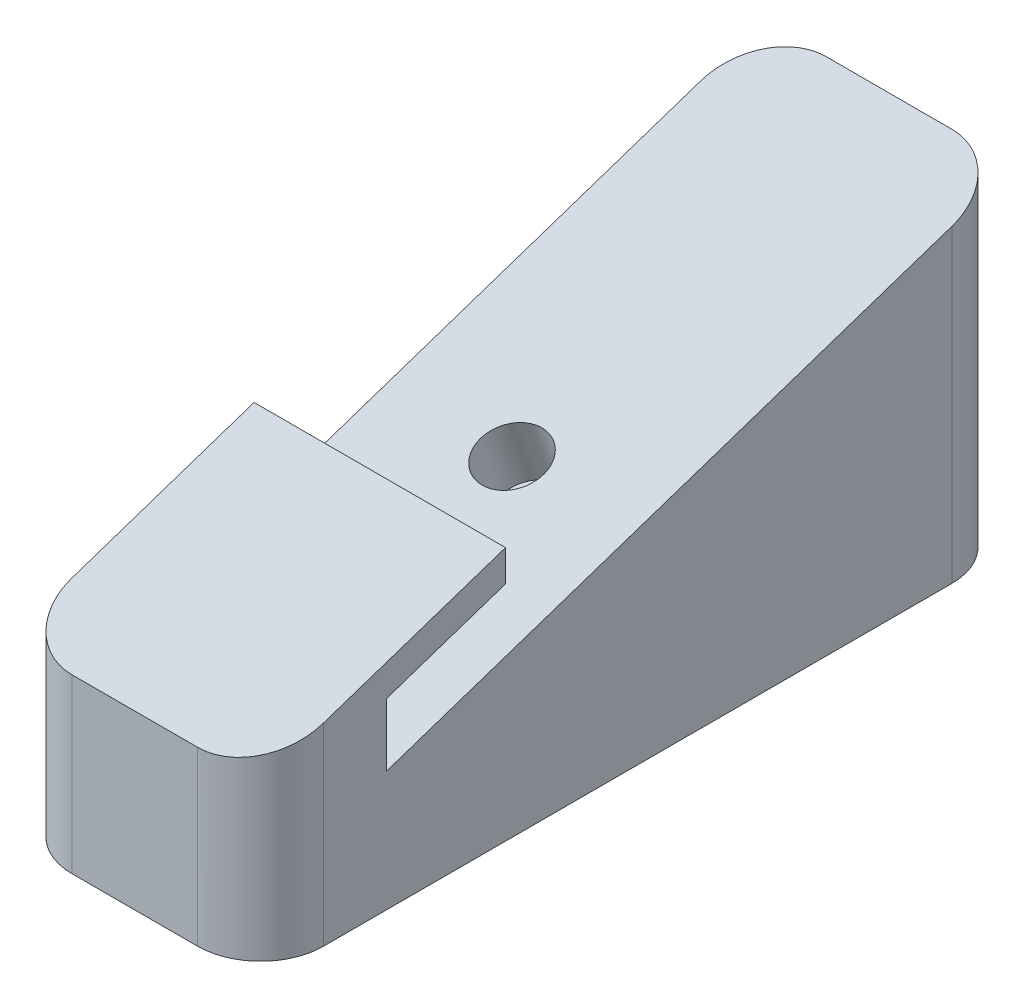
ISO-10303-21;
HEADER;
FILE_DESCRIPTION(('STEP AP214'),'2;1');
FILE_NAME('part.step','',(''),(''),'','','');
FILE_SCHEMA(('AUTOMOTIVE_DESIGN { 1 0 10303 214 1 1 1 1 }'));
ENDSEC;
DATA;
#1=APPLICATION_CONTEXT('core data for automotive mechanical design processes');
#2=APPLICATION_PROTOCOL_DEFINITION('international standard','automotive_design',2000,#1);
#3=PRODUCT_CONTEXT('',#1,'mechanical');
#4=PRODUCT('Part','Part','',(#3));
#5=PRODUCT_RELATED_PRODUCT_CATEGORY('part','',(#4));
#6=PRODUCT_DEFINITION_FORMATION('','',#4);
#7=PRODUCT_DEFINITION_CONTEXT('part definition',#1,'design');
#8=PRODUCT_DEFINITION('design','',#6,#7);
#9=PRODUCT_DEFINITION_SHAPE('','',#8);
#10=(LENGTH_UNIT() NAMED_UNIT(*) SI_UNIT(.MILLI.,.METRE.));
#11=(NAMED_UNIT(*) PLANE_ANGLE_UNIT() SI_UNIT($,.RADIAN.));
#12=(NAMED_UNIT(*) SI_UNIT($,.STERADIAN.) SOLID_ANGLE_UNIT());
#13=UNCERTAINTY_MEASURE_WITH_UNIT(LENGTH_MEASURE(1.E-05),#10,'distance_accuracy_value','');
#14=(GEOMETRIC_REPRESENTATION_CONTEXT(3) GLOBAL_UNCERTAINTY_ASSIGNED_CONTEXT((#13)) GLOBAL_UNIT_ASSIGNED_CONTEXT((#10,
#11,#12)) REPRESENTATION_CONTEXT('',''));
#15=CARTESIAN_POINT('',(0.,0.,0.));
#16=DIRECTION('',(0.,0.,1.));
#17=DIRECTION('',(1.,0.,0.));
#18=AXIS2_PLACEMENT_3D('',#15,#16,#17);
#19=CARTESIAN_POINT('',(-12.7,21.6537972116183,25.4));
#20=DIRECTION('',(0.,0.,-1.));
#21=DIRECTION('',(-1.,0.,0.));
#22=AXIS2_PLACEMENT_3D('',#19,#20,#21);
#23=PLANE('',#22);
#24=DIRECTION('',(0.,-1.,0.));
#25=VECTOR('',#24,1.);
#26=CARTESIAN_POINT('',(-12.7,21.6537972116183,25.4));
#27=LINE('',#26,#25);
#28=CARTESIAN_POINT('',(-12.7,18.4787972116183,25.4));
#29=VERTEX_POINT('',#28);
#30=CARTESIAN_POINT('',(-12.7,12.1287972116183,25.4));
#31=VERTEX_POINT('',#30);
#32=EDGE_CURVE('E164',#29,#31,#27,.T.);
#33=ORIENTED_EDGE('',*,*,#32,.F.);
#34=DIRECTION('',(-1.,0.,0.));
#35=VECTOR('',#34,1.);
#36=CARTESIAN_POINT('',(12.7,18.4787972116183,25.4));
#37=LINE('',#36,#35);
#38=CARTESIAN_POINT('',(12.7,18.4787972116183,25.4));
#39=VERTEX_POINT('',#38);
#40=EDGE_CURVE('E145',#39,#29,#37,.T.);
#41=ORIENTED_EDGE('',*,*,#40,.F.);
#42=DIRECTION('',(0.,-1.,0.));
#43=VECTOR('',#42,1.);
#44=CARTESIAN_POINT('',(12.7,21.6537972116183,25.4));
#45=LINE('',#44,#43);
#46=CARTESIAN_POINT('',(12.7,12.1287972116183,25.4));
#47=VERTEX_POINT('',#46);
#48=EDGE_CURVE('E151',#39,#47,#45,.T.);
#49=ORIENTED_EDGE('',*,*,#48,.T.);
#50=DIRECTION('',(1.,0.,0.));
#51=VECTOR('',#50,1.);
#52=CARTESIAN_POINT('',(-12.7,12.1287972116183,25.4));
#53=LINE('',#52,#51);
#54=EDGE_CURVE('E152',#31,#47,#53,.T.);
#55=ORIENTED_EDGE('',*,*,#54,.F.);
#56=EDGE_LOOP('',(#33,#41,#49,#55));
#57=FACE_BOUND('',#56,.T.);
#58=ADVANCED_FACE('F35',(#57),#23,.T.);
#59=CARTESIAN_POINT('',(0.,33.3756,38.1));
#60=DIRECTION('',(0.,0.,-1.));
#61=DIRECTION('',(-1.,0.,0.));
#62=AXIS2_PLACEMENT_3D('',#59,#60,#61);
#63=PLANE('',#62);
#64=DIRECTION('',(1.,0.,0.));
#65=VECTOR('',#64,1.);
#66=CARTESIAN_POINT('',(-12.7,17.404436653942,38.1));
#67=LINE('',#66,#65);
#68=CARTESIAN_POINT('',(-6.35000000000002,17.404436653942,38.1));
#69=VERTEX_POINT('',#68);
#70=CARTESIAN_POINT('',(6.34999999999997,17.404436653942,38.1));
#71=VERTEX_POINT('',#70);
#72=EDGE_CURVE('E163',#69,#71,#67,.T.);
#73=ORIENTED_EDGE('',*,*,#72,.F.);
#74=DIRECTION('',(0.,-1.,0.));
#75=VECTOR('',#74,1.);
#76=CARTESIAN_POINT('',(-6.35000000000002,0.,38.1));
#77=LINE('',#76,#75);
#78=CARTESIAN_POINT('',(-6.35000000000002,0.,38.1));
#79=VERTEX_POINT('',#78);
#80=EDGE_CURVE('E192',#69,#79,#77,.T.);
#81=ORIENTED_EDGE('',*,*,#80,.T.);
#82=DIRECTION('',(1.,0.,0.));
#83=VECTOR('',#82,1.);
#84=CARTESIAN_POINT('',(0.,0.,38.1));
#85=LINE('',#84,#83);
#86=CARTESIAN_POINT('',(6.35000000000002,0.,38.1));
#87=VERTEX_POINT('',#86);
#88=EDGE_CURVE('E180',#79,#87,#85,.T.);
#89=ORIENTED_EDGE('',*,*,#88,.T.);
#90=DIRECTION('',(0.,-1.,0.));
#91=VECTOR('',#90,1.);
#92=CARTESIAN_POINT('',(6.35000000000002,33.3756,38.1));
#93=LINE('',#92,#91);
#94=EDGE_CURVE('E58',#87,#71,#93,.F.);
#95=ORIENTED_EDGE('',*,*,#94,.T.);
#96=EDGE_LOOP('',(#73,#81,#89,#95));
#97=FACE_BOUND('',#96,.T.);
#98=ADVANCED_FACE('F246',(#97),#63,.F.);
#99=CARTESIAN_POINT('',(12.7,33.3756,0.));
#100=DIRECTION('',(-1.,0.,0.));
#101=DIRECTION('',(0.,0.,1.));
#102=AXIS2_PLACEMENT_3D('',#99,#100,#101);
#103=PLANE('',#102);
#104=DIRECTION('',(0.,0.,-1.));
#105=VECTOR('',#104,1.);
#106=CARTESIAN_POINT('',(12.7,0.,0.));
#107=LINE('',#106,#105);
#108=CARTESIAN_POINT('',(12.7,0.,31.75));
#109=VERTEX_POINT('',#108);
#110=CARTESIAN_POINT('',(12.7,0.,-31.75));
#111=VERTEX_POINT('',#110);
#112=EDGE_CURVE('E200',#109,#111,#107,.T.);
#113=ORIENTED_EDGE('',*,*,#112,.T.);
#114=DIRECTION('',(0.,-1.,0.));
#115=VECTOR('',#114,1.);
#116=CARTESIAN_POINT('',(12.7,33.3756,-31.75));
#117=LINE('',#116,#115);
#118=CARTESIAN_POINT('',(12.7,31.2509197211618,-31.75));
#119=VERTEX_POINT('',#118);
#120=EDGE_CURVE('E11',#111,#119,#117,.F.);
#121=ORIENTED_EDGE('',*,*,#120,.T.);
#122=DIRECTION('',(0.,-0.317304656405093,0.948323655206199));
#123=VECTOR('',#122,1.);
#124=CARTESIAN_POINT('',(12.7,21.9110238089535,-3.83599353359909));
#125=LINE('',#124,#123);
#126=EDGE_CURVE('E177',#119,#47,#125,.T.);
#127=ORIENTED_EDGE('',*,*,#126,.T.);
#128=ORIENTED_EDGE('',*,*,#48,.F.);
#129=DIRECTION('',(0.,-0.317304656405093,0.948323655206199));
#130=VECTOR('',#129,1.);
#131=CARTESIAN_POINT('',(12.7,22.508566347963,13.3562895788812));
#132=LINE('',#131,#130);
#133=CARTESIAN_POINT('',(12.7,22.508566347963,13.3562895788812));
#134=VERTEX_POINT('',#133);
#135=EDGE_CURVE('E130',#134,#39,#132,.T.);
#136=ORIENTED_EDGE('',*,*,#135,.F.);
#137=DIRECTION('',(0.,-1.,0.));
#138=VECTOR('',#137,1.);
#139=CARTESIAN_POINT('',(12.7,25.683566347963,13.3562895788812));
#140=LINE('',#139,#138);
#141=CARTESIAN_POINT('',(12.7,25.683566347963,13.3562895788812));
#142=VERTEX_POINT('',#141);
#143=EDGE_CURVE('E137',#142,#134,#140,.T.);
#144=ORIENTED_EDGE('',*,*,#143,.F.);
#145=DIRECTION('',(0.,0.317304656405093,-0.948323655206199));
#146=VECTOR('',#145,1.);
#147=CARTESIAN_POINT('',(12.7,17.404436653942,38.1));
#148=LINE('',#147,#146);
#149=CARTESIAN_POINT('',(12.7,19.5291169327801,31.75));
#150=VERTEX_POINT('',#149);
#151=EDGE_CURVE('E161',#150,#142,#148,.T.);
#152=ORIENTED_EDGE('',*,*,#151,.F.);
#153=DIRECTION('',(0.,-1.,0.));
#154=VECTOR('',#153,1.);
#155=CARTESIAN_POINT('',(12.7,33.3756,31.75));
#156=LINE('',#155,#154);
#157=EDGE_CURVE('E43',#150,#109,#156,.T.);
#158=ORIENTED_EDGE('',*,*,#157,.T.);
#159=EDGE_LOOP('',(#113,#121,#127,#128,#136,#144,#152,#158));
#160=FACE_BOUND('',#159,.T.);
#161=ADVANCED_FACE('F149',(#160),#103,.F.);
#162=CARTESIAN_POINT('',(0.,33.3756,-38.1));
#163=DIRECTION('',(0.,0.,-1.));
#164=DIRECTION('',(-1.,0.,0.));
#165=AXIS2_PLACEMENT_3D('',#162,#163,#164);
#166=PLANE('',#165);
#167=DIRECTION('',(1.,0.,0.));
#168=VECTOR('',#167,1.);
#169=CARTESIAN_POINT('',(0.,0.,-38.1));
#170=LINE('',#169,#168);
#171=CARTESIAN_POINT('',(-6.35000000000002,0.,-38.1));
#172=VERTEX_POINT('',#171);
#173=CARTESIAN_POINT('',(6.35000000000002,0.,-38.1));
#174=VERTEX_POINT('',#173);
#175=EDGE_CURVE('E210',#172,#174,#170,.T.);
#176=ORIENTED_EDGE('',*,*,#175,.F.);
#177=DIRECTION('',(0.,-1.,0.));
#178=VECTOR('',#177,1.);
#179=CARTESIAN_POINT('',(-6.35000000000002,33.3756,-38.1));
#180=LINE('',#179,#178);
#181=CARTESIAN_POINT('',(-6.35000000000002,33.3756,-38.1));
#182=VERTEX_POINT('',#181);
#183=EDGE_CURVE('E185',#172,#182,#180,.F.);
#184=ORIENTED_EDGE('',*,*,#183,.T.);
#185=DIRECTION('',(1.,0.,0.));
#186=VECTOR('',#185,1.);
#187=CARTESIAN_POINT('',(0.,33.3756,-38.1));
#188=LINE('',#187,#186);
#189=CARTESIAN_POINT('',(6.35000000000002,33.3756,-38.1));
#190=VERTEX_POINT('',#189);
#191=EDGE_CURVE('E215',#182,#190,#188,.T.);
#192=ORIENTED_EDGE('',*,*,#191,.T.);
#193=DIRECTION('',(0.,-1.,0.));
#194=VECTOR('',#193,1.);
#195=CARTESIAN_POINT('',(6.35000000000002,0.,-38.1));
#196=LINE('',#195,#194);
#197=EDGE_CURVE('E225',#190,#174,#196,.T.);
#198=ORIENTED_EDGE('',*,*,#197,.T.);
#199=EDGE_LOOP('',(#176,#184,#192,#198));
#200=FACE_BOUND('',#199,.T.);
#201=ADVANCED_FACE('F279',(#200),#166,.T.);
#202=CARTESIAN_POINT('',(-12.7,33.3756,0.));
#203=DIRECTION('',(-1.,0.,0.));
#204=DIRECTION('',(0.,0.,1.));
#205=AXIS2_PLACEMENT_3D('',#202,#203,#204);
#206=PLANE('',#205);
#207=DIRECTION('',(0.,0.317304656405093,-0.948323655206199));
#208=VECTOR('',#207,1.);
#209=CARTESIAN_POINT('',(-12.7,7.87943665394197,38.1));
#210=LINE('',#209,#208);
#211=CARTESIAN_POINT('',(-12.7,31.2509197211618,-31.75));
#212=VERTEX_POINT('',#211);
#213=EDGE_CURVE('E172',#31,#212,#210,.T.);
#214=ORIENTED_EDGE('',*,*,#213,.T.);
#215=DIRECTION('',(0.,-1.,0.));
#216=VECTOR('',#215,1.);
#217=CARTESIAN_POINT('',(-12.7,33.3756,-31.75));
#218=LINE('',#217,#216);
#219=CARTESIAN_POINT('',(-12.7,0.,-31.75));
#220=VERTEX_POINT('',#219);
#221=EDGE_CURVE('E234',#212,#220,#218,.T.);
#222=ORIENTED_EDGE('',*,*,#221,.T.);
#223=DIRECTION('',(0.,0.,-1.));
#224=VECTOR('',#223,1.);
#225=CARTESIAN_POINT('',(-12.7,0.,0.));
#226=LINE('',#225,#224);
#227=CARTESIAN_POINT('',(-12.7,0.,31.75));
#228=VERTEX_POINT('',#227);
#229=EDGE_CURVE('E211',#228,#220,#226,.T.);
#230=ORIENTED_EDGE('',*,*,#229,.F.);
#231=DIRECTION('',(0.,-1.,0.));
#232=VECTOR('',#231,1.);
#233=CARTESIAN_POINT('',(-12.7,17.404436653942,31.75));
#234=LINE('',#233,#232);
#235=CARTESIAN_POINT('',(-12.7,19.5291169327801,31.75));
#236=VERTEX_POINT('',#235);
#237=EDGE_CURVE('E218',#228,#236,#234,.F.);
#238=ORIENTED_EDGE('',*,*,#237,.T.);
#239=DIRECTION('',(0.,0.317304656405093,-0.948323655206199));
#240=VECTOR('',#239,1.);
#241=CARTESIAN_POINT('',(-12.7,17.404436653942,38.1));
#242=LINE('',#241,#240);
#243=CARTESIAN_POINT('',(-12.7,25.683566347963,13.3562895788812));
#244=VERTEX_POINT('',#243);
#245=EDGE_CURVE('E155',#236,#244,#242,.T.);
#246=ORIENTED_EDGE('',*,*,#245,.T.);
#247=DIRECTION('',(0.,1.,0.));
#248=VECTOR('',#247,1.);
#249=CARTESIAN_POINT('',(-12.7,25.683566347963,13.3562895788812));
#250=LINE('',#249,#248);
#251=CARTESIAN_POINT('',(-12.7,22.508566347963,13.3562895788812));
#252=VERTEX_POINT('',#251);
#253=EDGE_CURVE('E136',#252,#244,#250,.T.);
#254=ORIENTED_EDGE('',*,*,#253,.F.);
#255=DIRECTION('',(0.,-0.317304656405093,0.948323655206199));
#256=VECTOR('',#255,1.);
#257=CARTESIAN_POINT('',(-12.7,22.508566347963,13.3562895788812));
#258=LINE('',#257,#256);
#259=EDGE_CURVE('E132',#252,#29,#258,.T.);
#260=ORIENTED_EDGE('',*,*,#259,.T.);
#261=ORIENTED_EDGE('',*,*,#32,.T.);
#262=EDGE_LOOP('',(#214,#222,#230,#238,#246,#254,#260,#261));
#263=FACE_BOUND('',#262,.T.);
#264=ADVANCED_FACE('F240',(#263),#206,.T.);
#265=CARTESIAN_POINT('',(0.,0.,0.));
#266=DIRECTION('',(0.,1.,0.));
#267=DIRECTION('',(0.,0.,1.));
#268=AXIS2_PLACEMENT_3D('',#265,#266,#267);
#269=PLANE('',#268);
#270=ORIENTED_EDGE('',*,*,#229,.T.);
#271=CARTESIAN_POINT('',(-6.35000000000002,0.,-31.75));
#272=DIRECTION('',(0.,1.,0.));
#273=DIRECTION('',(0.,0.,1.));
#274=AXIS2_PLACEMENT_3D('',#271,#272,#273);
#275=CIRCLE('',#274,6.35);
#276=EDGE_CURVE('E223',#220,#172,#275,.F.);
#277=ORIENTED_EDGE('',*,*,#276,.T.);
#278=ORIENTED_EDGE('',*,*,#175,.T.);
#279=CARTESIAN_POINT('',(6.35000000000002,0.,-31.75));
#280=DIRECTION('',(0.,1.,0.));
#281=DIRECTION('',(0.,0.,1.));
#282=AXIS2_PLACEMENT_3D('',#279,#280,#281);
#283=CIRCLE('',#282,6.35);
#284=EDGE_CURVE('E209',#174,#111,#283,.F.);
#285=ORIENTED_EDGE('',*,*,#284,.T.);
#286=ORIENTED_EDGE('',*,*,#112,.F.);
#287=CARTESIAN_POINT('',(6.35000000000002,0.,31.75));
#288=DIRECTION('',(0.,1.,0.));
#289=DIRECTION('',(0.,0.,1.));
#290=AXIS2_PLACEMENT_3D('',#287,#288,#289);
#291=CIRCLE('',#290,6.35);
#292=EDGE_CURVE('E207',#109,#87,#291,.F.);
#293=ORIENTED_EDGE('',*,*,#292,.T.);
#294=ORIENTED_EDGE('',*,*,#88,.F.);
#295=CARTESIAN_POINT('',(-6.35000000000002,0.,31.75));
#296=DIRECTION('',(0.,1.,0.));
#297=DIRECTION('',(0.,0.,1.));
#298=AXIS2_PLACEMENT_3D('',#295,#296,#297);
#299=CIRCLE('',#298,6.35);
#300=EDGE_CURVE('E230',#79,#228,#299,.F.);
#301=ORIENTED_EDGE('',*,*,#300,.T.);
#302=EDGE_LOOP('',(#270,#277,#278,#285,#286,#293,#294,#301));
#303=FACE_BOUND('',#302,.T.);
#304=ADVANCED_FACE('F205',(#303),#269,.F.);
#305=CARTESIAN_POINT('',(-12.7,7.87943665394197,38.1));
#306=DIRECTION('',(0.,-0.948323655206199,-0.317304656405093));
#307=DIRECTION('',(0.,0.317304656405093,-0.948323655206199));
#308=AXIS2_PLACEMENT_3D('',#305,#306,#307);
#309=PLANE('',#308);
#310=CARTESIAN_POINT('',(0.,20.627518326971,0.));
#311=DIRECTION('',(0.,0.948323655206199,0.317304656405093));
#312=DIRECTION('',(0.,-0.317304656405093,0.948323655206199));
#313=AXIS2_PLACEMENT_3D('',#310,#311,#312);
#314=CIRCLE('',#313,3.175);
#315=CARTESIAN_POINT('',(0.,19.6200760428848,3.01092760527968));
#316=VERTEX_POINT('',#315);
#317=EDGE_CURVE('E167',#316,#316,#314,.T.);
#318=ORIENTED_EDGE('',*,*,#317,.F.);
#319=EDGE_LOOP('',(#318));
#320=FACE_BOUND('',#319,.T.);
#321=ORIENTED_EDGE('',*,*,#191,.F.);
#322=CARTESIAN_POINT('',(-6.35000000000002,31.2509197211618,-31.75));
#323=DIRECTION('',(0.,-0.948323655206199,-0.317304656405093));
#324=DIRECTION('',(0.,-0.317304656405093,0.948323655206199));
#325=AXIS2_PLACEMENT_3D('',#322,#323,#324);
#326=ELLIPSE('',#325,6.69602615640679,6.35);
#327=EDGE_CURVE('E189',#182,#212,#326,.F.);
#328=ORIENTED_EDGE('',*,*,#327,.T.);
#329=ORIENTED_EDGE('',*,*,#213,.F.);
#330=ORIENTED_EDGE('',*,*,#54,.T.);
#331=ORIENTED_EDGE('',*,*,#126,.F.);
#332=CARTESIAN_POINT('',(6.35000000000002,31.2509197211618,-31.75));
#333=DIRECTION('',(0.,-0.948323655206199,-0.317304656405093));
#334=DIRECTION('',(0.,0.317304656405093,-0.948323655206199));
#335=AXIS2_PLACEMENT_3D('',#332,#333,#334);
#336=ELLIPSE('',#335,6.69602615640679,6.35);
#337=EDGE_CURVE('E187',#119,#190,#336,.F.);
#338=ORIENTED_EDGE('',*,*,#337,.T.);
#339=EDGE_LOOP('',(#321,#328,#329,#330,#331,#338));
#340=FACE_BOUND('',#339,.T.);
#341=ADVANCED_FACE('F270',(#320,#340),#309,.F.);
#342=CARTESIAN_POINT('',(0.,14.6056631164116,-2.01488456817234));
#343=DIRECTION('',(0.,0.948323655206199,0.317304656405093));
#344=DIRECTION('',(0.,-0.317304656405093,0.948323655206199));
#345=AXIS2_PLACEMENT_3D('',#342,#343,#344);
#346=CYLINDRICAL_SURFACE('',#345,3.175);
#347=CARTESIAN_POINT('',(0.,14.6056631164116,-2.01488456817234));
#348=DIRECTION('',(0.,0.948323655206199,0.317304656405093));
#349=DIRECTION('',(0.,-0.317304656405093,0.948323655206199));
#350=AXIS2_PLACEMENT_3D('',#347,#348,#349);
#351=CIRCLE('',#350,3.175);
#352=CARTESIAN_POINT('',(0.,13.5982208323255,0.996043037107344));
#353=VERTEX_POINT('',#352);
#354=EDGE_CURVE('E169',#353,#353,#351,.T.);
#355=CARTESIAN_POINT('',(0.,13.5982208323255,0.996043037107344));
#356=CARTESIAN_POINT('',(0.,13.6609484907688,1.01703141802581));
#357=CARTESIAN_POINT('',(0.,13.7236761492121,1.03801979894427));
#358=CARTESIAN_POINT('',(0.,13.8491314660988,1.07999656078119));
#359=CARTESIAN_POINT('',(0.,13.9118591245421,1.10098494169965));
#360=CARTESIAN_POINT('',(0.,14.0373144414287,1.14296170353658));
#361=CARTESIAN_POINT('',(0.,14.1000420998721,1.16395008445504));
#362=CARTESIAN_POINT('',(0.,14.2254974167587,1.20592684629196));
#363=CARTESIAN_POINT('',(0.,14.288225075202,1.22691522721042));
#364=CARTESIAN_POINT('',(0.,14.4136803920887,1.26889198904735));
#365=CARTESIAN_POINT('',(0.,14.476408050532,1.28988036996581));
#366=CARTESIAN_POINT('',(0.,14.6018633674187,1.33185713180273));
#367=CARTESIAN_POINT('',(0.,14.664591025862,1.3528455127212));
#368=CARTESIAN_POINT('',(0.,14.7900463427487,1.39482227455812));
#369=CARTESIAN_POINT('',(0.,14.852774001192,1.41581065547658));
#370=CARTESIAN_POINT('',(0.,14.9782293180786,1.45778741731351));
#371=CARTESIAN_POINT('',(0.,15.040956976522,1.47877579823197));
#372=CARTESIAN_POINT('',(0.,15.1664122934086,1.52075256006889));
#373=CARTESIAN_POINT('',(0.,15.2291399518519,1.54174094098735));
#374=CARTESIAN_POINT('',(0.,15.3545952687386,1.58371770282428));
#375=CARTESIAN_POINT('',(0.,15.4173229271819,1.60470608374274));
#376=CARTESIAN_POINT('',(0.,15.5427782440686,1.64668284557966));
#377=CARTESIAN_POINT('',(0.,15.6055059025119,1.66767122649812));
#378=CARTESIAN_POINT('',(0.,15.7309612193986,1.70964798833505));
#379=CARTESIAN_POINT('',(0.,15.7936888778419,1.73063636925351));
#380=CARTESIAN_POINT('',(0.,15.9191441947285,1.77261313109043));
#381=CARTESIAN_POINT('',(0.,15.9818718531719,1.7936015120089));
#382=CARTESIAN_POINT('',(0.,16.1073271700585,1.83557827384582));
#383=CARTESIAN_POINT('',(0.,16.1700548285019,1.85656665476428));
#384=CARTESIAN_POINT('',(0.,16.2955101453885,1.8985434166012));
#385=CARTESIAN_POINT('',(0.,16.3582378038318,1.91953179751967));
#386=CARTESIAN_POINT('',(0.,16.4836931207185,1.96150855935659));
#387=CARTESIAN_POINT('',(0.,16.5464207791618,1.98249694027505));
#388=CARTESIAN_POINT('',(0.,16.6718760960485,2.02447370211198));
#389=CARTESIAN_POINT('',(0.,16.7346037544918,2.04546208303044));
#390=CARTESIAN_POINT('',(0.,16.8600590713784,2.08743884486736));
#391=CARTESIAN_POINT('',(0.,16.9227867298218,2.10842722578582));
#392=CARTESIAN_POINT('',(0.,17.0482420467084,2.15040398762275));
#393=CARTESIAN_POINT('',(0.,17.1109697051517,2.17139236854121));
#394=CARTESIAN_POINT('',(0.,17.2364250220384,2.21336913037813));
#395=CARTESIAN_POINT('',(0.,17.2991526804817,2.23435751129659));
#396=CARTESIAN_POINT('',(0.,17.4246079973684,2.27633427313352));
#397=CARTESIAN_POINT('',(0.,17.4873356558117,2.29732265405198));
#398=CARTESIAN_POINT('',(0.,17.6127909726984,2.3392994158889));
#399=CARTESIAN_POINT('',(0.,17.6755186311417,2.36028779680737));
#400=CARTESIAN_POINT('',(0.,17.8009739480283,2.40226455864429));
#401=CARTESIAN_POINT('',(0.,17.8637016064717,2.42325293956275));
#402=CARTESIAN_POINT('',(0.,17.9891569233583,2.46522970139968));
#403=CARTESIAN_POINT('',(0.,18.0518845818017,2.48621808231814));
#404=CARTESIAN_POINT('',(0.,18.1773398986883,2.52819484415506));
#405=CARTESIAN_POINT('',(0.,18.2400675571316,2.54918322507352));
#406=CARTESIAN_POINT('',(0.,18.3655228740183,2.59115998691045));
#407=CARTESIAN_POINT('',(0.,18.4282505324616,2.61214836782891));
#408=CARTESIAN_POINT('',(0.,18.5537058493483,2.65412512966583));
#409=CARTESIAN_POINT('',(0.,18.6164335077916,2.67511351058429));
#410=CARTESIAN_POINT('',(0.,18.7418888246782,2.71709027242122));
#411=CARTESIAN_POINT('',(0.,18.8046164831216,2.73807865333968));
#412=CARTESIAN_POINT('',(0.,18.9300718000082,2.7800554151766));
#413=CARTESIAN_POINT('',(0.,18.9927994584516,2.80104379609506));
#414=CARTESIAN_POINT('',(0.,19.1182547753382,2.84302055793199));
#415=CARTESIAN_POINT('',(0.,19.1809824337815,2.86400893885045));
#416=CARTESIAN_POINT('',(0.,19.3064377506682,2.90598570068737));
#417=CARTESIAN_POINT('',(0.,19.3691654091115,2.92697408160584));
#418=CARTESIAN_POINT('',(0.,19.4946207259982,2.96895084344276));
#419=CARTESIAN_POINT('',(0.,19.5573483844415,2.98993922436122));
#420=CARTESIAN_POINT('',(0.,19.6200760428848,3.01092760527968));
#421=B_SPLINE_CURVE_WITH_KNOTS('',3,(#355,#356,#357,#358,#359,#360,#361,#362,#363,#364,#365,
#366,#367,#368,#369,#370,#371,#372,#373,#374,#375,#376,#377,#378,#379,#380,#381,#382,#383,#384,
#385,#386,#387,#388,#389,#390,#391,#392,#393,#394,#395,#396,#397,#398,#399,#400,#401,#402,#403,
#404,#405,#406,#407,#408,#409,#410,#411,#412,#413,#414,#415,#416,#417,#418,#419,#420),
.UNSPECIFIED.,.F.,.F.,(4,2,2,2,2,2,2,2,2,2,2,2,2,2,2,2,2,2,2,2,2,2,2,2,2,2,2,2,2,2,2,2,4),(0.,
0.1984375,0.396875,0.5953125,0.793750000000002,0.992187500000001,1.190625,1.3890625,1.5875,
1.7859375,1.984375,2.1828125,2.38125,2.5796875,2.778125,2.9765625,3.175,3.3734375,3.571875,
3.7703125,3.96875,4.1671875,4.365625,4.5640625,4.7625,4.9609375,5.159375,5.3578125,5.55625,
5.7546875,5.953125,6.1515625,6.35),.UNSPECIFIED.);
#422=EDGE_CURVE('BSEAM266',#353,#316,#421,.T.);
#423=ORIENTED_EDGE('',*,*,#354,.F.);
#424=ORIENTED_EDGE('',*,*,#317,.T.);
#425=ORIENTED_EDGE('',*,*,#422,.T.);
#426=ORIENTED_EDGE('',*,*,#422,.F.);
#427=EDGE_LOOP('',(#423,#425,#424,#426));
#428=FACE_BOUND('',#427,.T.);
#429=ADVANCED_FACE('F266',(#428),#346,.F.);
#430=CARTESIAN_POINT('',(0.,14.6056631164116,-2.01488456817234));
#431=DIRECTION('',(0.,0.948323655206199,0.317304656405093));
#432=DIRECTION('',(0.,-0.317304656405093,0.948323655206199));
#433=AXIS2_PLACEMENT_3D('',#430,#431,#432);
#434=PLANE('',#433);
#435=ORIENTED_EDGE('',*,*,#354,.T.);
#436=EDGE_LOOP('',(#435));
#437=FACE_BOUND('',#436,.T.);
#438=ADVANCED_FACE('F263',(#437),#434,.T.);
#439=CARTESIAN_POINT('',(0.,28.0756934735207,6.20697520975769));
#440=DIRECTION('',(0.,-0.948323655206199,-0.317304656405093));
#441=DIRECTION('',(0.,0.317304656405093,-0.948323655206199));
#442=AXIS2_PLACEMENT_3D('',#439,#440,#441);
#443=PLANE('',#442);
#444=ORIENTED_EDGE('',*,*,#245,.F.);
#445=CARTESIAN_POINT('',(-6.35000000000002,19.5291169327801,31.75));
#446=DIRECTION('',(0.,-0.948323655206199,-0.317304656405093));
#447=DIRECTION('',(0.,0.317304656405093,-0.948323655206199));
#448=AXIS2_PLACEMENT_3D('',#445,#446,#447);
#449=ELLIPSE('',#448,6.69602615640679,6.35);
#450=EDGE_CURVE('E196',#236,#69,#449,.F.);
#451=ORIENTED_EDGE('',*,*,#450,.T.);
#452=ORIENTED_EDGE('',*,*,#72,.T.);
#453=CARTESIAN_POINT('',(6.35000000000002,19.5291169327801,31.75));
#454=DIRECTION('',(0.,-0.948323655206199,-0.317304656405093));
#455=DIRECTION('',(0.,-0.317304656405093,0.948323655206199));
#456=AXIS2_PLACEMENT_3D('',#453,#454,#455);
#457=ELLIPSE('',#456,6.69602615640679,6.35);
#458=EDGE_CURVE('E50',#71,#150,#457,.F.);
#459=ORIENTED_EDGE('',*,*,#458,.T.);
#460=ORIENTED_EDGE('',*,*,#151,.T.);
#461=DIRECTION('',(1.,0.,0.));
#462=VECTOR('',#461,1.);
#463=CARTESIAN_POINT('',(12.7,25.683566347963,13.3562895788812));
#464=LINE('',#463,#462);
#465=EDGE_CURVE('E143',#244,#142,#464,.T.);
#466=ORIENTED_EDGE('',*,*,#465,.F.);
#467=EDGE_LOOP('',(#444,#451,#452,#459,#460,#466));
#468=FACE_BOUND('',#467,.T.);
#469=ADVANCED_FACE('F243',(#468),#443,.F.);
#470=CARTESIAN_POINT('',(12.7,22.508566347963,13.3562895788812));
#471=DIRECTION('',(0.,0.948323655206199,0.317304656405093));
#472=DIRECTION('',(0.,-0.317304656405093,0.948323655206199));
#473=AXIS2_PLACEMENT_3D('',#470,#471,#472);
#474=PLANE('',#473);
#475=ORIENTED_EDGE('',*,*,#40,.T.);
#476=ORIENTED_EDGE('',*,*,#259,.F.);
#477=DIRECTION('',(-1.,0.,0.));
#478=VECTOR('',#477,1.);
#479=CARTESIAN_POINT('',(12.7,22.508566347963,13.3562895788812));
#480=LINE('',#479,#478);
#481=EDGE_CURVE('E125',#134,#252,#480,.T.);
#482=ORIENTED_EDGE('',*,*,#481,.F.);
#483=ORIENTED_EDGE('',*,*,#135,.T.);
#484=EDGE_LOOP('',(#475,#476,#482,#483));
#485=FACE_BOUND('',#484,.T.);
#486=ADVANCED_FACE('F128',(#485),#474,.F.);
#487=CARTESIAN_POINT('',(0.,4.02976913634467,13.3562895788812));
#488=DIRECTION('',(0.,0.,-1.));
#489=DIRECTION('',(-1.,0.,0.));
#490=AXIS2_PLACEMENT_3D('',#487,#488,#489);
#491=PLANE('',#490);
#492=ORIENTED_EDGE('',*,*,#143,.T.);
#493=ORIENTED_EDGE('',*,*,#481,.T.);
#494=ORIENTED_EDGE('',*,*,#253,.T.);
#495=ORIENTED_EDGE('',*,*,#465,.T.);
#496=EDGE_LOOP('',(#492,#493,#494,#495));
#497=FACE_BOUND('',#496,.T.);
#498=ADVANCED_FACE('F141',(#497),#491,.T.);
#499=CARTESIAN_POINT('',(-6.35000000000002,33.3756,-31.75));
#500=DIRECTION('',(0.,-1.,0.));
#501=DIRECTION('',(0.,0.,-1.));
#502=AXIS2_PLACEMENT_3D('',#499,#500,#501);
#503=CYLINDRICAL_SURFACE('',#502,6.35);
#504=ORIENTED_EDGE('',*,*,#327,.F.);
#505=ORIENTED_EDGE('',*,*,#183,.F.);
#506=ORIENTED_EDGE('',*,*,#276,.F.);
#507=ORIENTED_EDGE('',*,*,#221,.F.);
#508=EDGE_LOOP('',(#504,#505,#506,#507));
#509=FACE_BOUND('',#508,.T.);
#510=ADVANCED_FACE('F284',(#509),#503,.T.);
#511=CARTESIAN_POINT('',(-6.35000000000002,33.3756,31.75));
#512=DIRECTION('',(0.,1.,0.));
#513=DIRECTION('',(0.,0.,1.));
#514=AXIS2_PLACEMENT_3D('',#511,#512,#513);
#515=CYLINDRICAL_SURFACE('',#514,6.35);
#516=ORIENTED_EDGE('',*,*,#450,.F.);
#517=ORIENTED_EDGE('',*,*,#237,.F.);
#518=ORIENTED_EDGE('',*,*,#300,.F.);
#519=ORIENTED_EDGE('',*,*,#80,.F.);
#520=EDGE_LOOP('',(#516,#517,#518,#519));
#521=FACE_BOUND('',#520,.T.);
#522=ADVANCED_FACE('F245',(#521),#515,.T.);
#523=CARTESIAN_POINT('',(6.35000000000002,33.3756,-31.75));
#524=DIRECTION('',(0.,1.,0.));
#525=DIRECTION('',(0.,0.,1.));
#526=AXIS2_PLACEMENT_3D('',#523,#524,#525);
#527=CYLINDRICAL_SURFACE('',#526,6.35);
#528=ORIENTED_EDGE('',*,*,#337,.F.);
#529=ORIENTED_EDGE('',*,*,#120,.F.);
#530=ORIENTED_EDGE('',*,*,#284,.F.);
#531=ORIENTED_EDGE('',*,*,#197,.F.);
#532=EDGE_LOOP('',(#528,#529,#530,#531));
#533=FACE_BOUND('',#532,.T.);
#534=ADVANCED_FACE('F248',(#533),#527,.T.);
#535=CARTESIAN_POINT('',(6.35000000000002,33.3756,31.75));
#536=DIRECTION('',(0.,-1.,0.));
#537=DIRECTION('',(0.,0.,-1.));
#538=AXIS2_PLACEMENT_3D('',#535,#536,#537);
#539=CYLINDRICAL_SURFACE('',#538,6.35);
#540=ORIENTED_EDGE('',*,*,#458,.F.);
#541=ORIENTED_EDGE('',*,*,#94,.F.);
#542=ORIENTED_EDGE('',*,*,#292,.F.);
#543=ORIENTED_EDGE('',*,*,#157,.F.);
#544=EDGE_LOOP('',(#540,#541,#542,#543));
#545=FACE_BOUND('',#544,.T.);
#546=ADVANCED_FACE('F37',(#545),#539,.T.);
#547=CLOSED_SHELL('',(#58,#98,#161,#201,#264,#304,#341,#429,#438,#469,#486,#498,#510,#522,#534,#546));
#548=MANIFOLD_SOLID_BREP('B2',#547);
#549=ADVANCED_BREP_SHAPE_REPRESENTATION('',(#18,#548),#14);
#550=SHAPE_DEFINITION_REPRESENTATION(#9,#549);
ENDSEC;
END-ISO-10303-21;
